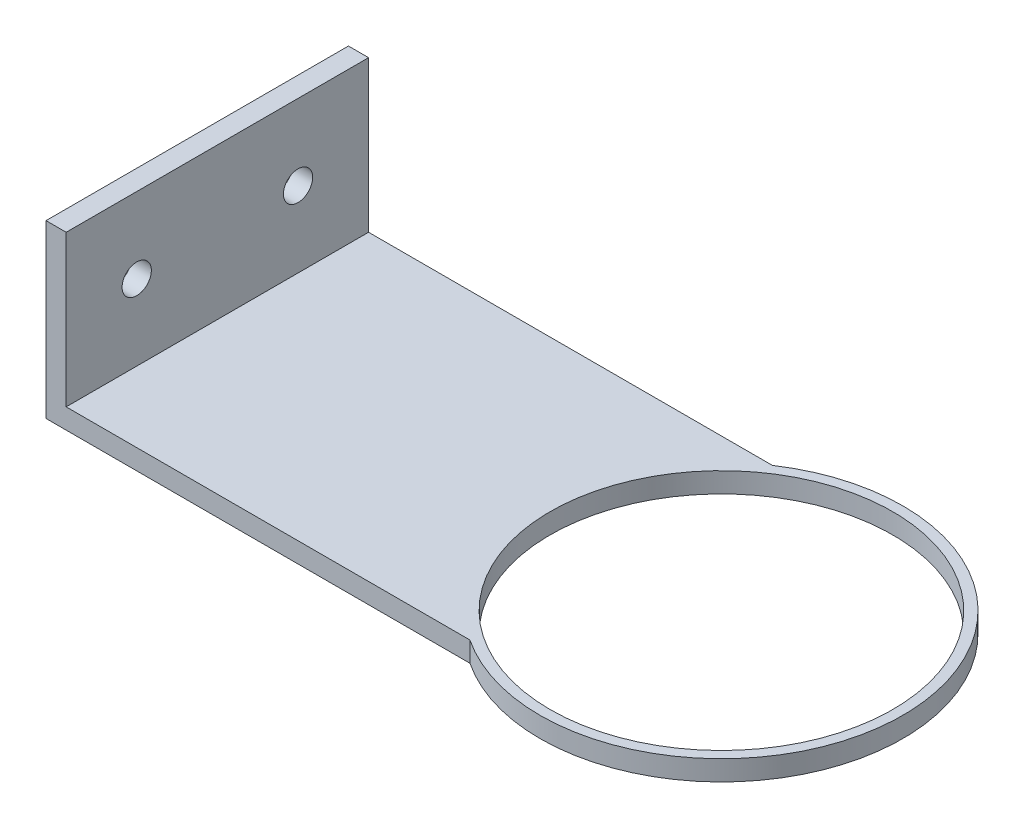
ISO-10303-21;
HEADER;
FILE_DESCRIPTION(('STEP AP214'),'2;1');
FILE_NAME('part.step','',(''),(''),'','','');
FILE_SCHEMA(('AUTOMOTIVE_DESIGN { 1 0 10303 214 1 1 1 1 }'));
ENDSEC;
DATA;
#1=APPLICATION_CONTEXT('core data for automotive mechanical design processes');
#2=APPLICATION_PROTOCOL_DEFINITION('international standard','automotive_design',2000,#1);
#3=PRODUCT_CONTEXT('',#1,'mechanical');
#4=PRODUCT('Part','Part','',(#3));
#5=PRODUCT_RELATED_PRODUCT_CATEGORY('part','',(#4));
#6=PRODUCT_DEFINITION_FORMATION('','',#4);
#7=PRODUCT_DEFINITION_CONTEXT('part definition',#1,'design');
#8=PRODUCT_DEFINITION('design','',#6,#7);
#9=PRODUCT_DEFINITION_SHAPE('','',#8);
#10=(LENGTH_UNIT() NAMED_UNIT(*) SI_UNIT(.MILLI.,.METRE.));
#11=(NAMED_UNIT(*) PLANE_ANGLE_UNIT() SI_UNIT($,.RADIAN.));
#12=(NAMED_UNIT(*) SI_UNIT($,.STERADIAN.) SOLID_ANGLE_UNIT());
#13=UNCERTAINTY_MEASURE_WITH_UNIT(LENGTH_MEASURE(1.E-05),#10,'distance_accuracy_value','');
#14=(GEOMETRIC_REPRESENTATION_CONTEXT(3) GLOBAL_UNCERTAINTY_ASSIGNED_CONTEXT((#13)) GLOBAL_UNIT_ASSIGNED_CONTEXT((#10,
#11,#12)) REPRESENTATION_CONTEXT('',''));
#15=CARTESIAN_POINT('',(0.,0.,0.));
#16=DIRECTION('',(0.,0.,1.));
#17=DIRECTION('',(1.,0.,0.));
#18=AXIS2_PLACEMENT_3D('',#15,#16,#17);
#19=CARTESIAN_POINT('',(0.,2.,0.));
#20=DIRECTION('',(0.,-1.,0.));
#21=DIRECTION('',(0.,0.,-1.));
#22=AXIS2_PLACEMENT_3D('',#19,#20,#21);
#23=CYLINDRICAL_SURFACE('',#22,18.);
#24=CARTESIAN_POINT('',(0.,0.,0.));
#25=DIRECTION('',(0.,1.,0.));
#26=DIRECTION('',(0.,0.,1.));
#27=AXIS2_PLACEMENT_3D('',#24,#25,#26);
#28=CIRCLE('',#27,18.);
#29=CARTESIAN_POINT('',(-9.9498743710662,0.,15.));
#30=VERTEX_POINT('',#29);
#31=CARTESIAN_POINT('',(-9.9498743710662,0.,-15.));
#32=VERTEX_POINT('',#31);
#33=EDGE_CURVE('E99',#30,#32,#28,.T.);
#34=ORIENTED_EDGE('',*,*,#33,.T.);
#35=DIRECTION('',(0.,-1.,0.));
#36=VECTOR('',#35,1.);
#37=CARTESIAN_POINT('',(-9.9498743710662,2.,-15.));
#38=LINE('',#37,#36);
#39=CARTESIAN_POINT('',(-9.9498743710662,2.,-15.));
#40=VERTEX_POINT('',#39);
#41=EDGE_CURVE('E11',#40,#32,#38,.T.);
#42=ORIENTED_EDGE('',*,*,#41,.F.);
#43=CARTESIAN_POINT('',(0.,2.,0.));
#44=DIRECTION('',(0.,1.,0.));
#45=DIRECTION('',(0.,0.,1.));
#46=AXIS2_PLACEMENT_3D('',#43,#44,#45);
#47=CIRCLE('',#46,18.);
#48=CARTESIAN_POINT('',(-9.9498743710662,2.,15.));
#49=VERTEX_POINT('',#48);
#50=EDGE_CURVE('E93',#49,#40,#47,.T.);
#51=ORIENTED_EDGE('',*,*,#50,.F.);
#52=DIRECTION('',(0.,-1.,0.));
#53=VECTOR('',#52,1.);
#54=CARTESIAN_POINT('',(-9.9498743710662,2.,15.));
#55=LINE('',#54,#53);
#56=EDGE_CURVE('E85',#49,#30,#55,.T.);
#57=ORIENTED_EDGE('',*,*,#56,.T.);
#58=EDGE_LOOP('',(#34,#42,#51,#57));
#59=FACE_BOUND('',#58,.T.);
#60=ADVANCED_FACE('F43',(#59),#23,.T.);
#61=CARTESIAN_POINT('',(0.,2.,-15.));
#62=DIRECTION('',(0.,0.,-1.));
#63=DIRECTION('',(-1.,0.,0.));
#64=AXIS2_PLACEMENT_3D('',#61,#62,#63);
#65=PLANE('',#64);
#66=DIRECTION('',(1.,0.,0.));
#67=VECTOR('',#66,1.);
#68=CARTESIAN_POINT('',(0.,0.,-15.));
#69=LINE('',#68,#67);
#70=CARTESIAN_POINT('',(-52.,0.,-15.));
#71=VERTEX_POINT('',#70);
#72=EDGE_CURVE('E104',#71,#32,#69,.T.);
#73=ORIENTED_EDGE('',*,*,#72,.F.);
#74=DIRECTION('',(0.,-1.,0.));
#75=VECTOR('',#74,1.);
#76=CARTESIAN_POINT('',(-52.,2.,-15.));
#77=LINE('',#76,#75);
#78=CARTESIAN_POINT('',(-52.,17.,-15.));
#79=VERTEX_POINT('',#78);
#80=EDGE_CURVE('E51',#79,#71,#77,.T.);
#81=ORIENTED_EDGE('',*,*,#80,.F.);
#82=DIRECTION('',(-1.,0.,0.));
#83=VECTOR('',#82,1.);
#84=CARTESIAN_POINT('',(-52.,17.,-15.));
#85=LINE('',#84,#83);
#86=CARTESIAN_POINT('',(-50.,17.,-15.));
#87=VERTEX_POINT('',#86);
#88=EDGE_CURVE('E142',#87,#79,#85,.T.);
#89=ORIENTED_EDGE('',*,*,#88,.F.);
#90=DIRECTION('',(0.,-1.,0.));
#91=VECTOR('',#90,1.);
#92=CARTESIAN_POINT('',(-50.,17.,-15.));
#93=LINE('',#92,#91);
#94=CARTESIAN_POINT('',(-50.,2.,-15.));
#95=VERTEX_POINT('',#94);
#96=EDGE_CURVE('E105',#87,#95,#93,.T.);
#97=ORIENTED_EDGE('',*,*,#96,.T.);
#98=DIRECTION('',(1.,0.,0.));
#99=VECTOR('',#98,1.);
#100=CARTESIAN_POINT('',(0.,2.,-15.));
#101=LINE('',#100,#99);
#102=EDGE_CURVE('E127',#95,#40,#101,.T.);
#103=ORIENTED_EDGE('',*,*,#102,.T.);
#104=ORIENTED_EDGE('',*,*,#41,.T.);
#105=EDGE_LOOP('',(#73,#81,#89,#97,#103,#104));
#106=FACE_BOUND('',#105,.T.);
#107=ADVANCED_FACE('F126',(#106),#65,.T.);
#108=CARTESIAN_POINT('',(-52.,2.,0.));
#109=DIRECTION('',(1.,0.,0.));
#110=DIRECTION('',(0.,0.,-1.));
#111=AXIS2_PLACEMENT_3D('',#108,#109,#110);
#112=PLANE('',#111);
#113=CARTESIAN_POINT('',(-52.,9.5,8.));
#114=DIRECTION('',(1.,0.,0.));
#115=DIRECTION('',(0.,0.,-1.));
#116=AXIS2_PLACEMENT_3D('',#113,#114,#115);
#117=CIRCLE('',#116,1.45);
#118=CARTESIAN_POINT('',(-52.,9.5,6.55));
#119=VERTEX_POINT('',#118);
#120=EDGE_CURVE('E151',#119,#119,#117,.T.);
#121=ORIENTED_EDGE('',*,*,#120,.T.);
#122=EDGE_LOOP('',(#121));
#123=FACE_BOUND('',#122,.T.);
#124=CARTESIAN_POINT('',(-52.,9.5,-8.));
#125=DIRECTION('',(1.,0.,0.));
#126=DIRECTION('',(0.,0.,-1.));
#127=AXIS2_PLACEMENT_3D('',#124,#125,#126);
#128=CIRCLE('',#127,1.45);
#129=CARTESIAN_POINT('',(-52.,9.5,-9.45));
#130=VERTEX_POINT('',#129);
#131=EDGE_CURVE('E138',#130,#130,#128,.T.);
#132=ORIENTED_EDGE('',*,*,#131,.T.);
#133=EDGE_LOOP('',(#132));
#134=FACE_BOUND('',#133,.T.);
#135=DIRECTION('',(0.,0.,1.));
#136=VECTOR('',#135,1.);
#137=CARTESIAN_POINT('',(-52.,0.,0.));
#138=LINE('',#137,#136);
#139=CARTESIAN_POINT('',(-52.,0.,15.));
#140=VERTEX_POINT('',#139);
#141=EDGE_CURVE('E94',#71,#140,#138,.T.);
#142=ORIENTED_EDGE('',*,*,#141,.T.);
#143=DIRECTION('',(0.,-1.,0.));
#144=VECTOR('',#143,1.);
#145=CARTESIAN_POINT('',(-52.,2.,15.));
#146=LINE('',#145,#144);
#147=CARTESIAN_POINT('',(-52.,17.,15.));
#148=VERTEX_POINT('',#147);
#149=EDGE_CURVE('E89',#148,#140,#146,.T.);
#150=ORIENTED_EDGE('',*,*,#149,.F.);
#151=DIRECTION('',(0.,0.,1.));
#152=VECTOR('',#151,1.);
#153=CARTESIAN_POINT('',(-52.,17.,-15.));
#154=LINE('',#153,#152);
#155=EDGE_CURVE('E122',#79,#148,#154,.T.);
#156=ORIENTED_EDGE('',*,*,#155,.F.);
#157=ORIENTED_EDGE('',*,*,#80,.T.);
#158=EDGE_LOOP('',(#142,#150,#156,#157));
#159=FACE_BOUND('',#158,.T.);
#160=ADVANCED_FACE('F119',(#123,#134,#159),#112,.F.);
#161=CARTESIAN_POINT('',(0.,2.,15.));
#162=DIRECTION('',(0.,0.,-1.));
#163=DIRECTION('',(-1.,0.,0.));
#164=AXIS2_PLACEMENT_3D('',#161,#162,#163);
#165=PLANE('',#164);
#166=DIRECTION('',(1.,0.,0.));
#167=VECTOR('',#166,1.);
#168=CARTESIAN_POINT('',(0.,0.,15.));
#169=LINE('',#168,#167);
#170=EDGE_CURVE('E82',#140,#30,#169,.T.);
#171=ORIENTED_EDGE('',*,*,#170,.T.);
#172=ORIENTED_EDGE('',*,*,#56,.F.);
#173=DIRECTION('',(1.,0.,0.));
#174=VECTOR('',#173,1.);
#175=CARTESIAN_POINT('',(0.,2.,15.));
#176=LINE('',#175,#174);
#177=CARTESIAN_POINT('',(-50.,2.,15.));
#178=VERTEX_POINT('',#177);
#179=EDGE_CURVE('E63',#178,#49,#176,.T.);
#180=ORIENTED_EDGE('',*,*,#179,.F.);
#181=DIRECTION('',(0.,-1.,0.));
#182=VECTOR('',#181,1.);
#183=CARTESIAN_POINT('',(-50.,17.,15.));
#184=LINE('',#183,#182);
#185=CARTESIAN_POINT('',(-50.,17.,15.));
#186=VERTEX_POINT('',#185);
#187=EDGE_CURVE('E109',#186,#178,#184,.T.);
#188=ORIENTED_EDGE('',*,*,#187,.F.);
#189=DIRECTION('',(1.,0.,0.));
#190=VECTOR('',#189,1.);
#191=CARTESIAN_POINT('',(-52.,17.,15.));
#192=LINE('',#191,#190);
#193=EDGE_CURVE('E135',#148,#186,#192,.T.);
#194=ORIENTED_EDGE('',*,*,#193,.F.);
#195=ORIENTED_EDGE('',*,*,#149,.T.);
#196=EDGE_LOOP('',(#171,#172,#180,#188,#194,#195));
#197=FACE_BOUND('',#196,.T.);
#198=ADVANCED_FACE('F84',(#197),#165,.F.);
#199=CARTESIAN_POINT('',(0.,2.,0.));
#200=DIRECTION('',(0.,1.,0.));
#201=DIRECTION('',(0.,0.,1.));
#202=AXIS2_PLACEMENT_3D('',#199,#200,#201);
#203=PLANE('',#202);
#204=CARTESIAN_POINT('',(0.,2.,0.));
#205=DIRECTION('',(0.,1.,0.));
#206=DIRECTION('',(0.,0.,1.));
#207=AXIS2_PLACEMENT_3D('',#204,#205,#206);
#208=CIRCLE('',#207,17.);
#209=CARTESIAN_POINT('',(0.,2.,17.));
#210=VERTEX_POINT('',#209);
#211=EDGE_CURVE('E157',#210,#210,#208,.T.);
#212=ORIENTED_EDGE('',*,*,#211,.F.);
#213=EDGE_LOOP('',(#212));
#214=FACE_BOUND('',#213,.T.);
#215=DIRECTION('',(0.,0.,-1.));
#216=VECTOR('',#215,1.);
#217=CARTESIAN_POINT('',(-50.,2.,-15.));
#218=LINE('',#217,#216);
#219=EDGE_CURVE('E58',#178,#95,#218,.T.);
#220=ORIENTED_EDGE('',*,*,#219,.F.);
#221=ORIENTED_EDGE('',*,*,#179,.T.);
#222=ORIENTED_EDGE('',*,*,#50,.T.);
#223=ORIENTED_EDGE('',*,*,#102,.F.);
#224=EDGE_LOOP('',(#220,#221,#222,#223));
#225=FACE_BOUND('',#224,.T.);
#226=ADVANCED_FACE('F130',(#214,#225),#203,.T.);
#227=CARTESIAN_POINT('',(0.,0.,0.));
#228=DIRECTION('',(0.,1.,0.));
#229=DIRECTION('',(0.,0.,1.));
#230=AXIS2_PLACEMENT_3D('',#227,#228,#229);
#231=PLANE('',#230);
#232=CARTESIAN_POINT('',(0.,0.,0.));
#233=DIRECTION('',(0.,1.,0.));
#234=DIRECTION('',(0.,0.,1.));
#235=AXIS2_PLACEMENT_3D('',#232,#233,#234);
#236=CIRCLE('',#235,17.);
#237=CARTESIAN_POINT('',(0.,0.,17.));
#238=VERTEX_POINT('',#237);
#239=EDGE_CURVE('E46',#238,#238,#236,.T.);
#240=ORIENTED_EDGE('',*,*,#239,.T.);
#241=EDGE_LOOP('',(#240));
#242=FACE_BOUND('',#241,.T.);
#243=ORIENTED_EDGE('',*,*,#33,.F.);
#244=ORIENTED_EDGE('',*,*,#170,.F.);
#245=ORIENTED_EDGE('',*,*,#141,.F.);
#246=ORIENTED_EDGE('',*,*,#72,.T.);
#247=EDGE_LOOP('',(#243,#244,#245,#246));
#248=FACE_BOUND('',#247,.T.);
#249=ADVANCED_FACE('F102',(#242,#248),#231,.F.);
#250=CARTESIAN_POINT('',(-50.,17.,-15.));
#251=DIRECTION('',(-1.,0.,0.));
#252=DIRECTION('',(0.,0.,1.));
#253=AXIS2_PLACEMENT_3D('',#250,#251,#252);
#254=PLANE('',#253);
#255=CARTESIAN_POINT('',(-50.,9.5,8.));
#256=DIRECTION('',(1.,0.,0.));
#257=DIRECTION('',(0.,0.,-1.));
#258=AXIS2_PLACEMENT_3D('',#255,#256,#257);
#259=CIRCLE('',#258,1.45);
#260=CARTESIAN_POINT('',(-50.,9.5,6.55));
#261=VERTEX_POINT('',#260);
#262=EDGE_CURVE('E154',#261,#261,#259,.T.);
#263=ORIENTED_EDGE('',*,*,#262,.F.);
#264=EDGE_LOOP('',(#263));
#265=FACE_BOUND('',#264,.T.);
#266=CARTESIAN_POINT('',(-50.,9.5,-8.));
#267=DIRECTION('',(1.,0.,0.));
#268=DIRECTION('',(0.,0.,-1.));
#269=AXIS2_PLACEMENT_3D('',#266,#267,#268);
#270=CIRCLE('',#269,1.45);
#271=CARTESIAN_POINT('',(-50.,9.5,-9.45));
#272=VERTEX_POINT('',#271);
#273=EDGE_CURVE('E148',#272,#272,#270,.T.);
#274=ORIENTED_EDGE('',*,*,#273,.F.);
#275=EDGE_LOOP('',(#274));
#276=FACE_BOUND('',#275,.T.);
#277=ORIENTED_EDGE('',*,*,#219,.T.);
#278=ORIENTED_EDGE('',*,*,#96,.F.);
#279=DIRECTION('',(0.,0.,-1.));
#280=VECTOR('',#279,1.);
#281=CARTESIAN_POINT('',(-50.,17.,-15.));
#282=LINE('',#281,#280);
#283=EDGE_CURVE('E137',#186,#87,#282,.T.);
#284=ORIENTED_EDGE('',*,*,#283,.F.);
#285=ORIENTED_EDGE('',*,*,#187,.T.);
#286=EDGE_LOOP('',(#277,#278,#284,#285));
#287=FACE_BOUND('',#286,.T.);
#288=ADVANCED_FACE('F189',(#265,#276,#287),#254,.F.);
#289=CARTESIAN_POINT('',(0.,17.,0.));
#290=DIRECTION('',(0.,1.,0.));
#291=DIRECTION('',(0.,0.,1.));
#292=AXIS2_PLACEMENT_3D('',#289,#290,#291);
#293=PLANE('',#292);
#294=ORIENTED_EDGE('',*,*,#283,.T.);
#295=ORIENTED_EDGE('',*,*,#88,.T.);
#296=ORIENTED_EDGE('',*,*,#155,.T.);
#297=ORIENTED_EDGE('',*,*,#193,.T.);
#298=EDGE_LOOP('',(#294,#295,#296,#297));
#299=FACE_BOUND('',#298,.T.);
#300=ADVANCED_FACE('F195',(#299),#293,.T.);
#301=CARTESIAN_POINT('',(-50.,9.5,-8.));
#302=DIRECTION('',(1.,0.,0.));
#303=DIRECTION('',(0.,0.,-1.));
#304=AXIS2_PLACEMENT_3D('',#301,#302,#303);
#305=CYLINDRICAL_SURFACE('',#304,1.45);
#306=ORIENTED_EDGE('',*,*,#131,.F.);
#307=EDGE_LOOP('',(#306));
#308=FACE_BOUND('',#307,.T.);
#309=ORIENTED_EDGE('',*,*,#273,.T.);
#310=EDGE_LOOP('',(#309));
#311=FACE_BOUND('',#310,.T.);
#312=ADVANCED_FACE('F172',(#308,#311),#305,.F.);
#313=CARTESIAN_POINT('',(-50.,9.5,8.));
#314=DIRECTION('',(1.,0.,0.));
#315=DIRECTION('',(0.,0.,-1.));
#316=AXIS2_PLACEMENT_3D('',#313,#314,#315);
#317=CYLINDRICAL_SURFACE('',#316,1.45);
#318=ORIENTED_EDGE('',*,*,#120,.F.);
#319=EDGE_LOOP('',(#318));
#320=FACE_BOUND('',#319,.T.);
#321=ORIENTED_EDGE('',*,*,#262,.T.);
#322=EDGE_LOOP('',(#321));
#323=FACE_BOUND('',#322,.T.);
#324=ADVANCED_FACE('F167',(#320,#323),#317,.F.);
#325=CARTESIAN_POINT('',(0.,-13.,0.));
#326=DIRECTION('',(0.,1.,0.));
#327=DIRECTION('',(0.,0.,1.));
#328=AXIS2_PLACEMENT_3D('',#325,#326,#327);
#329=CYLINDRICAL_SURFACE('',#328,17.);
#330=ORIENTED_EDGE('',*,*,#211,.T.);
#331=EDGE_LOOP('',(#330));
#332=FACE_BOUND('',#331,.T.);
#333=ORIENTED_EDGE('',*,*,#239,.F.);
#334=EDGE_LOOP('',(#333));
#335=FACE_BOUND('',#334,.T.);
#336=ADVANCED_FACE('F165',(#332,#335),#329,.F.);
#337=CLOSED_SHELL('',(#60,#107,#160,#198,#226,#249,#288,#300,#312,#324,#336));
#338=MANIFOLD_SOLID_BREP('B2',#337);
#339=ADVANCED_BREP_SHAPE_REPRESENTATION('',(#18,#338),#14);
#340=SHAPE_DEFINITION_REPRESENTATION(#9,#339);
ENDSEC;
END-ISO-10303-21;
